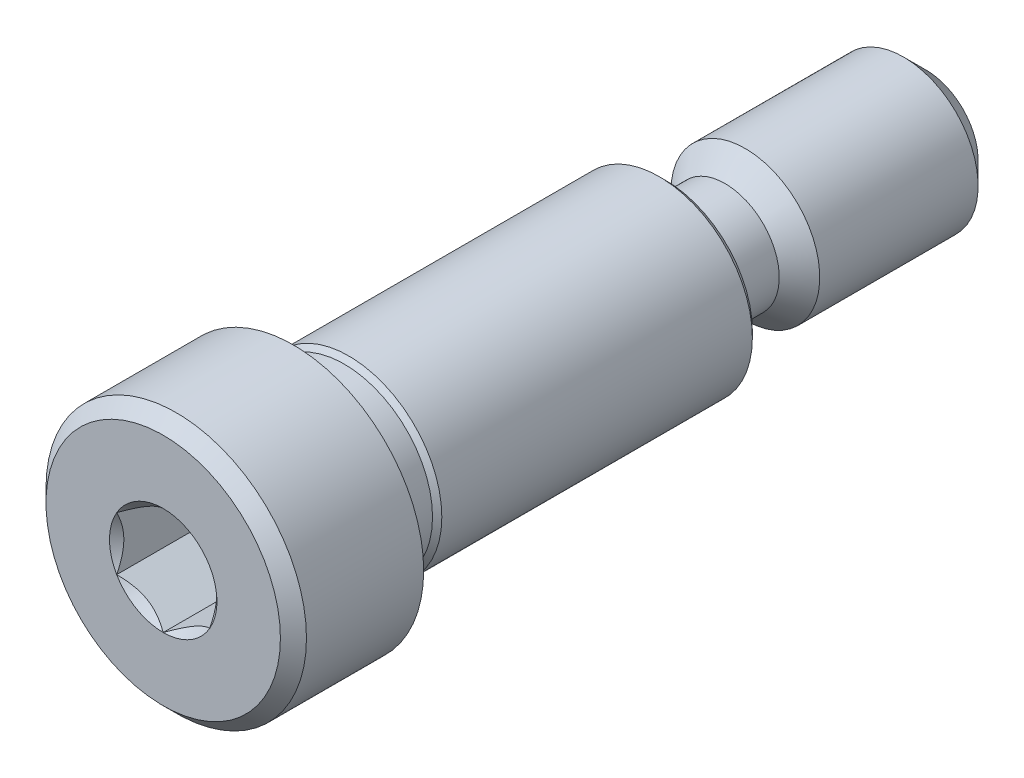
ISO-10303-21;
HEADER;
FILE_DESCRIPTION(('STEP AP214'),'2;1');
FILE_NAME('part.step','',(''),(''),'','','');
FILE_SCHEMA(('AUTOMOTIVE_DESIGN { 1 0 10303 214 1 1 1 1 }'));
ENDSEC;
DATA;
#1=APPLICATION_CONTEXT('core data for automotive mechanical design processes');
#2=APPLICATION_PROTOCOL_DEFINITION('international standard','automotive_design',2000,#1);
#3=PRODUCT_CONTEXT('',#1,'mechanical');
#4=PRODUCT('Part','Part','',(#3));
#5=PRODUCT_RELATED_PRODUCT_CATEGORY('part','',(#4));
#6=PRODUCT_DEFINITION_FORMATION('','',#4);
#7=PRODUCT_DEFINITION_CONTEXT('part definition',#1,'design');
#8=PRODUCT_DEFINITION('design','',#6,#7);
#9=PRODUCT_DEFINITION_SHAPE('','',#8);
#10=(LENGTH_UNIT() NAMED_UNIT(*) SI_UNIT(.MILLI.,.METRE.));
#11=(NAMED_UNIT(*) PLANE_ANGLE_UNIT() SI_UNIT($,.RADIAN.));
#12=(NAMED_UNIT(*) SI_UNIT($,.STERADIAN.) SOLID_ANGLE_UNIT());
#13=UNCERTAINTY_MEASURE_WITH_UNIT(LENGTH_MEASURE(1.E-05),#10,'distance_accuracy_value','');
#14=(GEOMETRIC_REPRESENTATION_CONTEXT(3) GLOBAL_UNCERTAINTY_ASSIGNED_CONTEXT((#13)) GLOBAL_UNIT_ASSIGNED_CONTEXT((#10,
#11,#12)) REPRESENTATION_CONTEXT('',''));
#15=CARTESIAN_POINT('',(0.,0.,0.));
#16=DIRECTION('',(0.,0.,1.));
#17=DIRECTION('',(1.,0.,0.));
#18=AXIS2_PLACEMENT_3D('',#15,#16,#17);
#19=CARTESIAN_POINT('',(0.,5.000625,16.271875));
#20=DIRECTION('',(0.,0.,-1.));
#21=DIRECTION('',(-1.,0.,0.));
#22=AXIS2_PLACEMENT_3D('',#19,#20,#21);
#23=PLANE('',#22);
#24=CARTESIAN_POINT('',(0.,0.,16.271875));
#25=DIRECTION('',(0.,0.,1.));
#26=DIRECTION('',(1.,0.,0.));
#27=AXIS2_PLACEMENT_3D('',#24,#25,#26);
#28=CIRCLE('',#27,2.29135888084633);
#29=CARTESIAN_POINT('',(-1.984375,1.14567944042316,16.271875));
#30=VERTEX_POINT('',#29);
#31=CARTESIAN_POINT('',(-1.984375,-1.14567944042316,16.271875));
#32=VERTEX_POINT('',#31);
#33=EDGE_CURVE('E139',#30,#32,#28,.T.);
#34=ORIENTED_EDGE('',*,*,#33,.F.);
#35=CARTESIAN_POINT('',(0.,2.29135888084633,16.271875));
#36=VERTEX_POINT('',#35);
#37=EDGE_CURVE('E132',#36,#30,#28,.T.);
#38=ORIENTED_EDGE('',*,*,#37,.F.);
#39=CARTESIAN_POINT('',(1.984375,1.14567944042317,16.271875));
#40=VERTEX_POINT('',#39);
#41=EDGE_CURVE('E104',#40,#36,#28,.T.);
#42=ORIENTED_EDGE('',*,*,#41,.F.);
#43=CARTESIAN_POINT('',(1.984375,-1.14567944042317,16.271875));
#44=VERTEX_POINT('',#43);
#45=EDGE_CURVE('E95',#44,#40,#28,.T.);
#46=ORIENTED_EDGE('',*,*,#45,.F.);
#47=CARTESIAN_POINT('',(0.,-2.29135888084633,16.271875));
#48=VERTEX_POINT('',#47);
#49=EDGE_CURVE('E53',#48,#44,#28,.T.);
#50=ORIENTED_EDGE('',*,*,#49,.F.);
#51=EDGE_CURVE('E64',#32,#48,#28,.T.);
#52=ORIENTED_EDGE('',*,*,#51,.F.);
#53=EDGE_LOOP('',(#34,#38,#42,#46,#50,#52));
#54=FACE_BOUND('',#53,.T.);
#55=CARTESIAN_POINT('',(0.,0.,16.271875));
#56=DIRECTION('',(0.,0.,1.));
#57=DIRECTION('',(1.,0.,0.));
#58=AXIS2_PLACEMENT_3D('',#55,#56,#57);
#59=CIRCLE('',#58,5.000625);
#60=CARTESIAN_POINT('',(5.000625,0.,16.271875));
#61=VERTEX_POINT('',#60);
#62=EDGE_CURVE('E48',#61,#61,#59,.T.);
#63=ORIENTED_EDGE('',*,*,#62,.T.);
#64=EDGE_LOOP('',(#63));
#65=FACE_BOUND('',#64,.T.);
#66=ADVANCED_FACE('F37',(#54,#65),#23,.F.);
#67=CARTESIAN_POINT('',(0.,0.,15.71625));
#68=DIRECTION('',(0.,0.,-1.));
#69=DIRECTION('',(-1.,0.,0.));
#70=AXIS2_PLACEMENT_3D('',#67,#68,#69);
#71=CONICAL_SURFACE('',#70,5.55625,0.785398163397447);
#72=ORIENTED_EDGE('',*,*,#62,.F.);
#73=EDGE_LOOP('',(#72));
#74=FACE_BOUND('',#73,.T.);
#75=CARTESIAN_POINT('',(0.,0.,15.71625));
#76=DIRECTION('',(0.,0.,1.));
#77=DIRECTION('',(1.,0.,0.));
#78=AXIS2_PLACEMENT_3D('',#75,#76,#77);
#79=CIRCLE('',#78,5.55625);
#80=CARTESIAN_POINT('',(5.55625,0.,15.71625));
#81=VERTEX_POINT('',#80);
#82=EDGE_CURVE('E307',#81,#81,#79,.T.);
#83=ORIENTED_EDGE('',*,*,#82,.T.);
#84=EDGE_LOOP('',(#83));
#85=FACE_BOUND('',#84,.T.);
#86=ADVANCED_FACE('F209',(#74,#85),#71,.T.);
#87=CARTESIAN_POINT('',(0.,0.,16.271875));
#88=DIRECTION('',(0.,0.,1.));
#89=DIRECTION('',(1.,0.,0.));
#90=AXIS2_PLACEMENT_3D('',#87,#88,#89);
#91=CYLINDRICAL_SURFACE('',#90,5.55625);
#92=ORIENTED_EDGE('',*,*,#82,.F.);
#93=EDGE_LOOP('',(#92));
#94=FACE_BOUND('',#93,.T.);
#95=CARTESIAN_POINT('',(0.,0.,10.715625));
#96=DIRECTION('',(0.,0.,1.));
#97=DIRECTION('',(1.,0.,0.));
#98=AXIS2_PLACEMENT_3D('',#95,#96,#97);
#99=CIRCLE('',#98,5.55625);
#100=CARTESIAN_POINT('',(5.55625,0.,10.715625));
#101=VERTEX_POINT('',#100);
#102=EDGE_CURVE('E301',#101,#101,#99,.T.);
#103=ORIENTED_EDGE('',*,*,#102,.T.);
#104=EDGE_LOOP('',(#103));
#105=FACE_BOUND('',#104,.T.);
#106=ADVANCED_FACE('F213',(#94,#105),#91,.T.);
#107=CARTESIAN_POINT('',(0.,5.55625,10.715625));
#108=DIRECTION('',(0.,0.,1.));
#109=DIRECTION('',(1.,0.,0.));
#110=AXIS2_PLACEMENT_3D('',#107,#108,#109);
#111=PLANE('',#110);
#112=ORIENTED_EDGE('',*,*,#102,.F.);
#113=EDGE_LOOP('',(#112));
#114=FACE_BOUND('',#113,.T.);
#115=CARTESIAN_POINT('',(0.,0.,10.715625));
#116=DIRECTION('',(0.,0.,1.));
#117=DIRECTION('',(1.,0.,0.));
#118=AXIS2_PLACEMENT_3D('',#115,#116,#117);
#119=CIRCLE('',#118,3.96875);
#120=CARTESIAN_POINT('',(3.96875,0.,10.715625));
#121=VERTEX_POINT('',#120);
#122=EDGE_CURVE('E299',#121,#121,#119,.T.);
#123=ORIENTED_EDGE('',*,*,#122,.T.);
#124=EDGE_LOOP('',(#123));
#125=FACE_BOUND('',#124,.T.);
#126=ADVANCED_FACE('F218',(#114,#125),#111,.F.);
#127=CARTESIAN_POINT('',(0.,0.,10.5171875));
#128=DIRECTION('',(0.,0.,1.));
#129=DIRECTION('',(1.,0.,0.));
#130=AXIS2_PLACEMENT_3D('',#127,#128,#129);
#131=CONICAL_SURFACE('',#130,3.7703125,0.785398163397452);
#132=ORIENTED_EDGE('',*,*,#122,.F.);
#133=EDGE_LOOP('',(#132));
#134=FACE_BOUND('',#133,.T.);
#135=CARTESIAN_POINT('',(0.,0.,10.5171875));
#136=DIRECTION('',(0.,0.,1.));
#137=DIRECTION('',(1.,0.,0.));
#138=AXIS2_PLACEMENT_3D('',#135,#136,#137);
#139=CIRCLE('',#138,3.7703125);
#140=CARTESIAN_POINT('',(3.7703125,0.,10.5171875));
#141=VERTEX_POINT('',#140);
#142=EDGE_CURVE('E300',#141,#141,#139,.T.);
#143=ORIENTED_EDGE('',*,*,#142,.T.);
#144=EDGE_LOOP('',(#143));
#145=FACE_BOUND('',#144,.T.);
#146=ADVANCED_FACE('F230',(#134,#145),#131,.T.);
#147=CARTESIAN_POINT('',(0.,0.,16.271875));
#148=DIRECTION('',(0.,0.,1.));
#149=DIRECTION('',(1.,0.,0.));
#150=AXIS2_PLACEMENT_3D('',#147,#148,#149);
#151=CYLINDRICAL_SURFACE('',#150,3.7703125);
#152=ORIENTED_EDGE('',*,*,#142,.F.);
#153=EDGE_LOOP('',(#152));
#154=FACE_BOUND('',#153,.T.);
#155=CARTESIAN_POINT('',(0.,0.,8.55186249999999));
#156=DIRECTION('',(0.,0.,1.));
#157=DIRECTION('',(1.,0.,0.));
#158=AXIS2_PLACEMENT_3D('',#155,#156,#157);
#159=CIRCLE('',#158,3.7703125);
#160=CARTESIAN_POINT('',(3.7703125,0.,8.55186249999999));
#161=VERTEX_POINT('',#160);
#162=EDGE_CURVE('E293',#161,#161,#159,.T.);
#163=ORIENTED_EDGE('',*,*,#162,.T.);
#164=EDGE_LOOP('',(#163));
#165=FACE_BOUND('',#164,.T.);
#166=ADVANCED_FACE('F232',(#154,#165),#151,.T.);
#167=CARTESIAN_POINT('',(0.,0.,8.353425));
#168=DIRECTION('',(0.,0.,-1.));
#169=DIRECTION('',(-1.,0.,0.));
#170=AXIS2_PLACEMENT_3D('',#167,#168,#169);
#171=CONICAL_SURFACE('',#170,3.96875,0.785398163397459);
#172=ORIENTED_EDGE('',*,*,#162,.F.);
#173=EDGE_LOOP('',(#172));
#174=FACE_BOUND('',#173,.T.);
#175=CARTESIAN_POINT('',(0.,0.,8.353425));
#176=DIRECTION('',(0.,0.,1.));
#177=DIRECTION('',(1.,0.,0.));
#178=AXIS2_PLACEMENT_3D('',#175,#176,#177);
#179=CIRCLE('',#178,3.96875);
#180=CARTESIAN_POINT('',(3.96875,0.,8.353425));
#181=VERTEX_POINT('',#180);
#182=EDGE_CURVE('E294',#181,#181,#179,.T.);
#183=ORIENTED_EDGE('',*,*,#182,.T.);
#184=EDGE_LOOP('',(#183));
#185=FACE_BOUND('',#184,.T.);
#186=ADVANCED_FACE('F233',(#174,#185),#171,.T.);
#187=CARTESIAN_POINT('',(0.,0.,16.271875));
#188=DIRECTION('',(0.,0.,1.));
#189=DIRECTION('',(1.,0.,0.));
#190=AXIS2_PLACEMENT_3D('',#187,#188,#189);
#191=CYLINDRICAL_SURFACE('',#190,3.96875);
#192=ORIENTED_EDGE('',*,*,#182,.F.);
#193=EDGE_LOOP('',(#192));
#194=FACE_BOUND('',#193,.T.);
#195=CARTESIAN_POINT('',(0.,0.,-4.89479166666666));
#196=DIRECTION('',(0.,0.,1.));
#197=DIRECTION('',(1.,0.,0.));
#198=AXIS2_PLACEMENT_3D('',#195,#196,#197);
#199=CIRCLE('',#198,3.96875);
#200=CARTESIAN_POINT('',(3.96875,0.,-4.89479166666666));
#201=VERTEX_POINT('',#200);
#202=EDGE_CURVE('E290',#201,#201,#199,.T.);
#203=ORIENTED_EDGE('',*,*,#202,.T.);
#204=EDGE_LOOP('',(#203));
#205=FACE_BOUND('',#204,.T.);
#206=ADVANCED_FACE('F238',(#194,#205),#191,.T.);
#207=CARTESIAN_POINT('',(0.,0.,-5.159375));
#208=DIRECTION('',(0.,0.,1.));
#209=DIRECTION('',(1.,0.,0.));
#210=AXIS2_PLACEMENT_3D('',#207,#208,#209);
#211=CONICAL_SURFACE('',#210,3.70416666666667,0.785398163397439);
#212=ORIENTED_EDGE('',*,*,#202,.F.);
#213=EDGE_LOOP('',(#212));
#214=FACE_BOUND('',#213,.T.);
#215=CARTESIAN_POINT('',(0.,0.,-5.159375));
#216=DIRECTION('',(0.,0.,1.));
#217=DIRECTION('',(1.,0.,0.));
#218=AXIS2_PLACEMENT_3D('',#215,#216,#217);
#219=CIRCLE('',#218,3.70416666666667);
#220=CARTESIAN_POINT('',(3.70416666666667,0.,-5.159375));
#221=VERTEX_POINT('',#220);
#222=EDGE_CURVE('E276',#221,#221,#219,.T.);
#223=ORIENTED_EDGE('',*,*,#222,.T.);
#224=EDGE_LOOP('',(#223));
#225=FACE_BOUND('',#224,.T.);
#226=ADVANCED_FACE('F245',(#214,#225),#211,.T.);
#227=CARTESIAN_POINT('',(0.,3.70416666666667,-5.159375));
#228=DIRECTION('',(0.,0.,1.));
#229=DIRECTION('',(1.,0.,0.));
#230=AXIS2_PLACEMENT_3D('',#227,#228,#229);
#231=PLANE('',#230);
#232=CARTESIAN_POINT('',(0.,0.,-5.159375));
#233=DIRECTION('',(0.,0.,-1.));
#234=DIRECTION('',(-1.,0.,0.));
#235=AXIS2_PLACEMENT_3D('',#232,#233,#234);
#236=CIRCLE('',#235,3.175);
#237=CARTESIAN_POINT('',(-3.175,0.,-5.159375));
#238=VERTEX_POINT('',#237);
#239=EDGE_CURVE('E441',#238,#238,#236,.T.);
#240=ORIENTED_EDGE('',*,*,#239,.F.);
#241=EDGE_LOOP('',(#240));
#242=FACE_BOUND('',#241,.T.);
#243=ORIENTED_EDGE('',*,*,#222,.F.);
#244=EDGE_LOOP('',(#243));
#245=FACE_BOUND('',#244,.T.);
#246=ADVANCED_FACE('F250',(#242,#245),#231,.F.);
#247=CARTESIAN_POINT('',(0.,0.,16.271875));
#248=DIRECTION('',(0.,0.,1.));
#249=DIRECTION('',(1.,0.,0.));
#250=AXIS2_PLACEMENT_3D('',#247,#248,#249);
#251=CONICAL_SURFACE('',#250,2.29135888084633,0.78539816339745);
#252=ORIENTED_EDGE('',*,*,#41,.T.);
#253=CARTESIAN_POINT('',(1.984575,1.14556397036933,16.2719904787818));
#254=CARTESIAN_POINT('',(1.9163590048332,1.18494849354192,16.2326378522639));
#255=CARTESIAN_POINT('',(1.84700231489303,1.22499159714897,16.1955963104462));
#256=CARTESIAN_POINT('',(1.70557619954781,1.30664400291398,16.1277738584233));
#257=CARTESIAN_POINT('',(1.63349332126322,1.34826107209555,16.0970306890917));
#258=CARTESIAN_POINT('',(1.488141602734,1.43217992591557,16.0443668888112));
#259=CARTESIAN_POINT('',(1.41490978751306,1.47446033414663,16.02231387588));
#260=CARTESIAN_POINT('',(1.2668338174053,1.55995203534886,15.9883364929439));
#261=CARTESIAN_POINT('',(1.19199418724658,1.60316071596705,15.9763867560917));
#262=CARTESIAN_POINT('',(1.06301458545619,1.6776271237807,15.9656050990819));
#263=CARTESIAN_POINT('',(1.00904128422756,1.7087886237741,15.9640088990591));
#264=CARTESIAN_POINT('',(0.901182881480202,1.77106070163465,15.9666968388653));
#265=CARTESIAN_POINT('',(0.84729781751448,1.80217125782056,15.9709830403405));
#266=CARTESIAN_POINT('',(0.740036461751399,1.86409863044402,15.9851918730135));
#267=CARTESIAN_POINT('',(0.686660807239863,1.89491507894443,15.9951208104523));
#268=CARTESIAN_POINT('',(0.580832482591107,1.95601509066827,16.0200700842745));
#269=CARTESIAN_POINT('',(0.528379742028902,1.9862986945516,16.0350900303895));
#270=CARTESIAN_POINT('',(0.394017661036354,2.06387267818152,16.0796828516357));
#271=CARTESIAN_POINT('',(0.312941642841679,2.11068193911104,16.1126179959383));
#272=CARTESIAN_POINT('',(0.193726693270163,2.17951072233758,16.1682174412022));
#273=CARTESIAN_POINT('',(0.154440075614001,2.20219286161692,16.1877525920519));
#274=CARTESIAN_POINT('',(0.0765946381319486,2.24713694590237,16.2286037381194));
#275=CARTESIAN_POINT('',(0.0380353888983024,2.26939913882716,16.2499186395683));
#276=CARTESIAN_POINT('',(-0.000199999999998845,2.29147435090017,16.2719904787818));
#277=B_SPLINE_CURVE_WITH_KNOTS('',3,(#253,#254,#255,#256,#257,#258,#259,#260,#261,#262,#263,
#264,#265,#266,#267,#268,#269,#270,#271,#272,#273,#274,#275,#276),.UNSPECIFIED.,.F.,.F.,(4,2,2,
2,2,2,2,2,2,2,2,4),(0.,0.264339630306627,0.530219665093693,0.791876416371457,1.05287424418109,
1.239639843932,1.42647091743852,1.61351120244034,1.8005371524754,2.09764209964316,
2.24579179873713,2.39385111134157),.UNSPECIFIED.);
#278=EDGE_CURVE('E11',#40,#36,#277,.T.);
#279=ORIENTED_EDGE('',*,*,#278,.F.);
#280=EDGE_LOOP('',(#252,#279));
#281=FACE_BOUND('',#280,.T.);
#282=ADVANCED_FACE('F108',(#281),#251,.F.);
#283=ORIENTED_EDGE('',*,*,#37,.T.);
#284=CARTESIAN_POINT('',(0.000200000000000114,2.29147435090017,16.2719904787818));
#285=CARTESIAN_POINT('',(-0.0680159951668023,2.25208982772757,16.2326378522639));
#286=CARTESIAN_POINT('',(-0.137372685106966,2.21204672412052,16.1955963104462));
#287=CARTESIAN_POINT('',(-0.278798800452186,2.13039431835551,16.1277738584233));
#288=CARTESIAN_POINT('',(-0.350881678736781,2.08877724917394,16.0970306890918));
#289=CARTESIAN_POINT('',(-0.496233397266002,2.00485839535392,16.0443668888112));
#290=CARTESIAN_POINT('',(-0.569465212486936,1.96257798712287,16.02231387588));
#291=CARTESIAN_POINT('',(-0.717541182594704,1.87708628592063,15.9883364929439));
#292=CARTESIAN_POINT('',(-0.792380812753422,1.83387760530245,15.9763867560917));
#293=CARTESIAN_POINT('',(-0.921360414543813,1.75941119748879,15.9656050990819));
#294=CARTESIAN_POINT('',(-0.97533371577244,1.72824969749539,15.9640088990591));
#295=CARTESIAN_POINT('',(-1.0831921185198,1.66597761963484,15.9666968388653));
#296=CARTESIAN_POINT('',(-1.13707718248552,1.63486706344893,15.9709830403405));
#297=CARTESIAN_POINT('',(-1.2443385382486,1.57293969082547,15.9851918730135));
#298=CARTESIAN_POINT('',(-1.29771419276014,1.54212324232507,15.9951208104523));
#299=CARTESIAN_POINT('',(-1.40354251740889,1.48102323060122,16.0200700842745));
#300=CARTESIAN_POINT('',(-1.4559952579711,1.4507396267179,16.0350900303895));
#301=CARTESIAN_POINT('',(-1.59035733896365,1.37316564308797,16.0796828516357));
#302=CARTESIAN_POINT('',(-1.67143335715832,1.32635638215845,16.1126179959383));
#303=CARTESIAN_POINT('',(-1.79064830672984,1.25752759893191,16.1682174412022));
#304=CARTESIAN_POINT('',(-1.829934924386,1.23484545965257,16.1877525920519));
#305=CARTESIAN_POINT('',(-1.90778036186805,1.18990137536713,16.2286037381194));
#306=CARTESIAN_POINT('',(-1.9463396111017,1.16763918244233,16.2499186395684));
#307=CARTESIAN_POINT('',(-1.984575,1.14556397036933,16.2719904787818));
#308=B_SPLINE_CURVE_WITH_KNOTS('',3,(#284,#285,#286,#287,#288,#289,#290,#291,#292,#293,#294,
#295,#296,#297,#298,#299,#300,#301,#302,#303,#304,#305,#306,#307),.UNSPECIFIED.,.F.,.F.,(4,2,2,
2,2,2,2,2,2,2,2,4),(0.,0.264339630306625,0.530219665093691,0.791876416371457,1.05287424418109,
1.239639843932,1.42647091743852,1.61351120244034,1.8005371524754,2.09764209964316,
2.24579179873713,2.39385111134157),.UNSPECIFIED.);
#309=EDGE_CURVE('E135',#36,#30,#308,.T.);
#310=ORIENTED_EDGE('',*,*,#309,.F.);
#311=EDGE_LOOP('',(#283,#310));
#312=FACE_BOUND('',#311,.T.);
#313=ADVANCED_FACE('F339',(#312),#251,.F.);
#314=ORIENTED_EDGE('',*,*,#33,.T.);
#315=CARTESIAN_POINT('',(-1.984375,-2.28495242157822,17.0068590788166));
#316=CARTESIAN_POINT('',(-1.984375,-2.22931635455402,16.9648616855508));
#317=CARTESIAN_POINT('',(-1.984375,-2.17336876548389,16.9232710540763));
#318=CARTESIAN_POINT('',(-1.984375,-2.06072770258171,16.8410834614715));
#319=CARTESIAN_POINT('',(-1.984375,-2.00403404503435,16.800486752405));
#320=CARTESIAN_POINT('',(-1.984375,-1.88936329173489,16.7201785031747));
#321=CARTESIAN_POINT('',(-1.984375,-1.83137965519348,16.6804762588133));
#322=CARTESIAN_POINT('',(-1.984375,-1.71442802137841,16.6025601734013));
#323=CARTESIAN_POINT('',(-1.984375,-1.65546009407228,16.5643462271944));
#324=CARTESIAN_POINT('',(-1.984375,-1.47005472306036,16.4481278340136));
#325=CARTESIAN_POINT('',(-1.984375,-1.34163909427884,16.3732228868724));
#326=CARTESIAN_POINT('',(-1.984375,-1.0784038470548,16.2362052154397));
#327=CARTESIAN_POINT('',(-1.984375,-0.943607781407427,16.1740493664824));
#328=CARTESIAN_POINT('',(-1.984375,-0.741275100444884,16.0980075786886));
#329=CARTESIAN_POINT('',(-1.984375,-0.676735408881097,16.076183061326));
#330=CARTESIAN_POINT('',(-1.984375,-0.546098118112763,16.0377154635378));
#331=CARTESIAN_POINT('',(-1.984375,-0.480000411919957,16.0210727400656));
#332=CARTESIAN_POINT('',(-1.984375,-0.347746170028533,15.9941103808697));
#333=CARTESIAN_POINT('',(-1.984375,-0.281612071479124,15.9836824097359));
#334=CARTESIAN_POINT('',(-1.984375,-0.148636620052351,15.9693531473766));
#335=CARTESIAN_POINT('',(-1.984375,-0.0817953907393253,15.9654507342274));
#336=CARTESIAN_POINT('',(-1.984375,0.0495156750890627,15.9644620513327));
#337=CARTESIAN_POINT('',(-1.984375,0.11398377510299,15.967134178875));
#338=CARTESIAN_POINT('',(-1.984375,0.242367515846175,15.9786142104975));
#339=CARTESIAN_POINT('',(-1.984375,0.306283102295918,15.9874227106392));
#340=CARTESIAN_POINT('',(-1.984375,0.434181040262182,16.0108440213329));
#341=CARTESIAN_POINT('',(-1.984375,0.498145026858308,16.0255556062321));
#342=CARTESIAN_POINT('',(-1.984375,0.624675616953006,16.0600011814121));
#343=CARTESIAN_POINT('',(-1.984375,0.687242336899688,16.0797347514492));
#344=CARTESIAN_POINT('',(-1.984375,0.884225483826086,16.1492872372308));
#345=CARTESIAN_POINT('',(-1.984375,1.01583674256468,16.2070274112565));
#346=CARTESIAN_POINT('',(-1.984375,1.27288659242652,16.3354053365888));
#347=CARTESIAN_POINT('',(-1.984375,1.3983008827048,16.4060894249194));
#348=CARTESIAN_POINT('',(-1.984375,1.57956687990221,16.5163916638132));
#349=CARTESIAN_POINT('',(-1.984375,1.63738271299424,16.5528448294754));
#350=CARTESIAN_POINT('',(-1.984375,1.75202215386202,16.6272909632917));
#351=CARTESIAN_POINT('',(-1.984375,1.80884568601362,16.665284048078));
#352=CARTESIAN_POINT('',(-1.984375,1.92116923084255,16.7422138088931));
#353=CARTESIAN_POINT('',(-1.984375,1.97667624512253,16.7811403130388));
#354=CARTESIAN_POINT('',(-1.984375,2.08693170717166,16.8600227461214));
#355=CARTESIAN_POINT('',(-1.984375,2.14168035934792,16.899978389024));
#356=CARTESIAN_POINT('',(-1.984375,2.19611149046622,16.9403556112854));
#357=B_SPLINE_CURVE_WITH_KNOTS('',3,(#315,#316,#317,#318,#319,#320,#321,#322,#323,#324,#325,
#326,#327,#328,#329,#330,#331,#332,#333,#334,#335,#336,#337,#338,#339,#340,#341,#342,#343,#344,
#345,#346,#347,#348,#349,#350,#351,#352,#353,#354,#355,#356),.UNSPECIFIED.,.F.,.F.,(4,2,2,2,2,2,
2,2,2,2,2,2,2,2,2,2,2,2,2,2,4),(0.,0.20912607000832,0.418304637356566,0.629103979977989,
0.839888401371181,1.28549951116127,1.72957750768351,1.93379389749971,2.13802435186698,
2.33858179514333,2.53910475350639,2.73236963400794,2.92565329006887,3.12231577097487,
3.31896180041345,3.74886295245172,4.18033428125362,4.3853601718029,4.59040161996382,
4.79377749165107,4.99709743524131),.UNSPECIFIED.);
#358=EDGE_CURVE('E131',#30,#32,#357,.F.);
#359=ORIENTED_EDGE('',*,*,#358,.F.);
#360=EDGE_LOOP('',(#314,#359));
#361=FACE_BOUND('',#360,.T.);
#362=ADVANCED_FACE('F332',(#361),#251,.F.);
#363=ORIENTED_EDGE('',*,*,#51,.T.);
#364=CARTESIAN_POINT('',(-1.984575,-1.14556397036933,16.2719904787818));
#365=CARTESIAN_POINT('',(-1.9163590048332,-1.18494849354192,16.2326378522639));
#366=CARTESIAN_POINT('',(-1.84700231489303,-1.22499159714897,16.1955963104462));
#367=CARTESIAN_POINT('',(-1.70557619954781,-1.30664400291398,16.1277738584233));
#368=CARTESIAN_POINT('',(-1.63349332126322,-1.34826107209555,16.0970306890917));
#369=CARTESIAN_POINT('',(-1.488141602734,-1.43217992591557,16.0443668888112));
#370=CARTESIAN_POINT('',(-1.41490978751306,-1.47446033414662,16.02231387588));
#371=CARTESIAN_POINT('',(-1.2668338174053,-1.55995203534886,15.9883364929439));
#372=CARTESIAN_POINT('',(-1.19199418724658,-1.60316071596705,15.9763867560917));
#373=CARTESIAN_POINT('',(-1.06301458545619,-1.6776271237807,15.9656050990819));
#374=CARTESIAN_POINT('',(-1.00904128422756,-1.7087886237741,15.9640088990591));
#375=CARTESIAN_POINT('',(-0.901182881480202,-1.77106070163465,15.9666968388653));
#376=CARTESIAN_POINT('',(-0.84729781751448,-1.80217125782056,15.9709830403405));
#377=CARTESIAN_POINT('',(-0.740036461751399,-1.86409863044402,15.9851918730135));
#378=CARTESIAN_POINT('',(-0.686660807239862,-1.89491507894443,15.9951208104523));
#379=CARTESIAN_POINT('',(-0.580832482591106,-1.95601509066827,16.0200700842745));
#380=CARTESIAN_POINT('',(-0.528379742028901,-1.9862986945516,16.0350900303895));
#381=CARTESIAN_POINT('',(-0.394017661036354,-2.06387267818152,16.0796828516357));
#382=CARTESIAN_POINT('',(-0.312941642841678,-2.11068193911104,16.1126179959383));
#383=CARTESIAN_POINT('',(-0.193726693270162,-2.17951072233758,16.1682174412022));
#384=CARTESIAN_POINT('',(-0.154440075614,-2.20219286161692,16.1877525920519));
#385=CARTESIAN_POINT('',(-0.0765946381319483,-2.24713694590237,16.2286037381194));
#386=CARTESIAN_POINT('',(-0.0380353888983021,-2.26939913882716,16.2499186395683));
#387=CARTESIAN_POINT('',(0.000199999999999197,-2.29147435090017,16.2719904787818));
#388=B_SPLINE_CURVE_WITH_KNOTS('',3,(#364,#365,#366,#367,#368,#369,#370,#371,#372,#373,#374,
#375,#376,#377,#378,#379,#380,#381,#382,#383,#384,#385,#386,#387),.UNSPECIFIED.,.F.,.F.,(4,2,2,
2,2,2,2,2,2,2,2,4),(0.,0.264339630306625,0.530219665093693,0.791876416371458,1.05287424418109,
1.239639843932,1.42647091743852,1.61351120244034,1.8005371524754,2.09764209964316,
2.24579179873713,2.39385111134157),.UNSPECIFIED.);
#389=EDGE_CURVE('E172',#32,#48,#388,.T.);
#390=ORIENTED_EDGE('',*,*,#389,.F.);
#391=EDGE_LOOP('',(#363,#390));
#392=FACE_BOUND('',#391,.T.);
#393=ADVANCED_FACE('F331',(#392),#251,.F.);
#394=ORIENTED_EDGE('',*,*,#49,.T.);
#395=CARTESIAN_POINT('',(-0.000200000000000085,-2.29147435090017,16.2719904787818));
#396=CARTESIAN_POINT('',(0.068015995166803,-2.25208982772757,16.2326378522639));
#397=CARTESIAN_POINT('',(0.137372685106966,-2.21204672412052,16.1955963104462));
#398=CARTESIAN_POINT('',(0.278798800452187,-2.13039431835551,16.1277738584233));
#399=CARTESIAN_POINT('',(0.350881678736782,-2.08877724917394,16.0970306890917));
#400=CARTESIAN_POINT('',(0.496233397266003,-2.00485839535392,16.0443668888112));
#401=CARTESIAN_POINT('',(0.569465212486938,-1.96257798712287,16.02231387588));
#402=CARTESIAN_POINT('',(0.717541182594705,-1.87708628592063,15.9883364929439));
#403=CARTESIAN_POINT('',(0.792380812753423,-1.83387760530244,15.9763867560917));
#404=CARTESIAN_POINT('',(0.921360414543813,-1.75941119748879,15.9656050990819));
#405=CARTESIAN_POINT('',(0.97533371577244,-1.72824969749539,15.9640088990591));
#406=CARTESIAN_POINT('',(1.0831921185198,-1.66597761963484,15.9666968388653));
#407=CARTESIAN_POINT('',(1.13707718248552,-1.63486706344893,15.9709830403405));
#408=CARTESIAN_POINT('',(1.2443385382486,-1.57293969082547,15.9851918730135));
#409=CARTESIAN_POINT('',(1.29771419276014,-1.54212324232506,15.9951208104523));
#410=CARTESIAN_POINT('',(1.40354251740889,-1.48102323060122,16.0200700842745));
#411=CARTESIAN_POINT('',(1.4559952579711,-1.4507396267179,16.0350900303895));
#412=CARTESIAN_POINT('',(1.59035733896365,-1.37316564308797,16.0796828516357));
#413=CARTESIAN_POINT('',(1.67143335715832,-1.32635638215845,16.1126179959383));
#414=CARTESIAN_POINT('',(1.79064830672984,-1.25752759893191,16.1682174412022));
#415=CARTESIAN_POINT('',(1.829934924386,-1.23484545965258,16.1877525920519));
#416=CARTESIAN_POINT('',(1.90778036186805,-1.18990137536713,16.2286037381194));
#417=CARTESIAN_POINT('',(1.9463396111017,-1.16763918244233,16.2499186395683));
#418=CARTESIAN_POINT('',(1.984575,-1.14556397036933,16.2719904787818));
#419=B_SPLINE_CURVE_WITH_KNOTS('',3,(#395,#396,#397,#398,#399,#400,#401,#402,#403,#404,#405,
#406,#407,#408,#409,#410,#411,#412,#413,#414,#415,#416,#417,#418),.UNSPECIFIED.,.F.,.F.,(4,2,2,
2,2,2,2,2,2,2,2,4),(0.,0.264339630306625,0.530219665093693,0.791876416371458,1.05287424418109,
1.239639843932,1.42647091743852,1.61351120244034,1.8005371524754,2.09764209964316,
2.24579179873713,2.39385111134157),.UNSPECIFIED.);
#420=EDGE_CURVE('E118',#48,#44,#419,.T.);
#421=ORIENTED_EDGE('',*,*,#420,.F.);
#422=EDGE_LOOP('',(#394,#421));
#423=FACE_BOUND('',#422,.T.);
#424=ADVANCED_FACE('F158',(#423),#251,.F.);
#425=ORIENTED_EDGE('',*,*,#45,.T.);
#426=CARTESIAN_POINT('',(1.984375,-2.28495242191067,17.0068590790676));
#427=CARTESIAN_POINT('',(1.984375,-2.22931635487714,16.9648616857921));
#428=CARTESIAN_POINT('',(1.984375,-2.17336876579766,16.923271054308));
#429=CARTESIAN_POINT('',(1.984375,-2.06072770287666,16.8410834616839));
#430=CARTESIAN_POINT('',(1.984375,-2.00403404531985,16.8004867526079));
#431=CARTESIAN_POINT('',(1.984375,-1.88936329200117,16.7201785033582));
#432=CARTESIAN_POINT('',(1.984375,-1.83137965544999,16.6804762589872));
#433=CARTESIAN_POINT('',(1.984375,-1.71442802161519,16.602560173556));
#434=CARTESIAN_POINT('',(1.984375,-1.65546009429911,16.5643462273396));
#435=CARTESIAN_POINT('',(1.984375,-1.47005472325436,16.4481278341287));
#436=CARTESIAN_POINT('',(1.984375,-1.34163909444949,16.3732228869673));
#437=CARTESIAN_POINT('',(1.984375,-1.07840384717678,16.2362052154972));
#438=CARTESIAN_POINT('',(1.984375,-0.943607781504099,16.1740493665226));
#439=CARTESIAN_POINT('',(1.984375,-0.74127510052251,16.098007578716));
#440=CARTESIAN_POINT('',(1.984375,-0.676735408966699,16.0761830613539));
#441=CARTESIAN_POINT('',(1.984375,-0.546098118214578,16.0377154635651));
#442=CARTESIAN_POINT('',(1.984375,-0.480000412030008,16.0210727400917));
#443=CARTESIAN_POINT('',(1.984375,-0.347746170154786,15.9941103808918));
#444=CARTESIAN_POINT('',(1.984375,-0.281612071613338,15.983682409755));
#445=CARTESIAN_POINT('',(1.984375,-0.148636620202221,15.9693531473881));
#446=CARTESIAN_POINT('',(1.984375,-0.0817953908968891,15.9654507342341));
#447=CARTESIAN_POINT('',(1.984375,0.049515674917302,15.9644620513286));
#448=CARTESIAN_POINT('',(1.984375,0.113983774924707,15.967134178865));
#449=CARTESIAN_POINT('',(1.984375,0.2423675156555,15.9786142104746));
#450=CARTESIAN_POINT('',(1.984375,0.306283102099374,15.9874227106093));
#451=CARTESIAN_POINT('',(1.984375,0.43418104005405,16.0108440212885));
#452=CARTESIAN_POINT('',(1.984375,0.498145026644475,16.0255556061801));
#453=CARTESIAN_POINT('',(1.984375,0.624675616728323,16.0600011813447));
#454=CARTESIAN_POINT('',(1.984375,0.687242336669855,16.079734751374));
#455=CARTESIAN_POINT('',(1.984375,0.884225483546208,16.1492872371188));
#456=CARTESIAN_POINT('',(1.984375,1.01583674224241,16.2070274111108));
#457=CARTESIAN_POINT('',(1.984375,1.27288659202273,16.3354053363718));
#458=CARTESIAN_POINT('',(1.984375,1.39830088226189,16.4060894246649));
#459=CARTESIAN_POINT('',(1.984375,1.57956687940503,16.5163916635036));
#460=CARTESIAN_POINT('',(1.984375,1.63738271248117,16.5528448291489));
#461=CARTESIAN_POINT('',(1.984375,1.75202215331741,16.6272909629313));
#462=CARTESIAN_POINT('',(1.984375,1.80884568545335,16.6652840477007));
#463=CARTESIAN_POINT('',(1.984375,1.92116923025135,16.7422138084819));
#464=CARTESIAN_POINT('',(1.984375,1.97667624451605,16.7811403126108));
#465=CARTESIAN_POINT('',(1.984375,2.08693170653472,16.8600227456598));
#466=CARTESIAN_POINT('',(1.984375,2.1416803586958,16.8999783885457));
#467=CARTESIAN_POINT('',(1.984375,2.19611148979894,16.9403556107903));
#468=B_SPLINE_CURVE_WITH_KNOTS('',3,(#426,#427,#428,#429,#430,#431,#432,#433,#434,#435,#436,
#437,#438,#439,#440,#441,#442,#443,#444,#445,#446,#447,#448,#449,#450,#451,#452,#453,#454,#455,
#456,#457,#458,#459,#460,#461,#462,#463,#464,#465,#466,#467),.UNSPECIFIED.,.F.,.F.,(4,2,2,2,2,2,
2,2,2,2,2,2,2,2,2,2,2,2,2,2,4),(0.,0.209126070048129,0.418304637436192,0.629103980098182,
0.839888401531931,1.28549951141298,1.72957750802533,1.93379389781847,2.13802435216272,
2.33858179541699,2.53910475375796,2.7323696342393,2.92565329027999,3.12231577116422,
3.31896180058102,3.7488629524628,4.18033428110718,4.38536017158908,4.59040161968261,
4.79377749130339,4.99709743482716),.UNSPECIFIED.);
#469=EDGE_CURVE('E100',#44,#40,#468,.T.);
#470=ORIENTED_EDGE('',*,*,#469,.F.);
#471=EDGE_LOOP('',(#425,#470));
#472=FACE_BOUND('',#471,.T.);
#473=ADVANCED_FACE('F92',(#472),#251,.F.);
#474=CARTESIAN_POINT('',(0.,0.,12.1046875));
#475=DIRECTION('',(0.,0.,1.));
#476=DIRECTION('',(1.,0.,0.));
#477=AXIS2_PLACEMENT_3D('',#474,#475,#476);
#478=PLANE('',#477);
#479=DIRECTION('',(0.,1.,0.));
#480=VECTOR('',#479,1.);
#481=CARTESIAN_POINT('',(1.984375,-1.14567944042317,12.1046875));
#482=LINE('',#481,#480);
#483=CARTESIAN_POINT('',(1.984375,-1.14567944042317,12.1046875));
#484=VERTEX_POINT('',#483);
#485=CARTESIAN_POINT('',(1.984375,1.14567944042317,12.1046875));
#486=VERTEX_POINT('',#485);
#487=EDGE_CURVE('E120',#484,#486,#482,.T.);
#488=ORIENTED_EDGE('',*,*,#487,.T.);
#489=DIRECTION('',(-0.866025403784439,0.5,0.));
#490=VECTOR('',#489,1.);
#491=CARTESIAN_POINT('',(1.984375,1.14567944042317,12.1046875));
#492=LINE('',#491,#490);
#493=CARTESIAN_POINT('',(0.,2.29135888084633,12.1046875));
#494=VERTEX_POINT('',#493);
#495=EDGE_CURVE('E125',#486,#494,#492,.T.);
#496=ORIENTED_EDGE('',*,*,#495,.T.);
#497=DIRECTION('',(-0.866025403784439,-0.5,0.));
#498=VECTOR('',#497,1.);
#499=CARTESIAN_POINT('',(0.,2.29135888084633,12.1046875));
#500=LINE('',#499,#498);
#501=CARTESIAN_POINT('',(-1.984375,1.14567944042316,12.1046875));
#502=VERTEX_POINT('',#501);
#503=EDGE_CURVE('E262',#494,#502,#500,.T.);
#504=ORIENTED_EDGE('',*,*,#503,.T.);
#505=DIRECTION('',(0.,-1.,0.));
#506=VECTOR('',#505,1.);
#507=CARTESIAN_POINT('',(-1.984375,1.14567944042316,12.1046875));
#508=LINE('',#507,#506);
#509=CARTESIAN_POINT('',(-1.984375,-1.14567944042316,12.1046875));
#510=VERTEX_POINT('',#509);
#511=EDGE_CURVE('E267',#502,#510,#508,.T.);
#512=ORIENTED_EDGE('',*,*,#511,.T.);
#513=DIRECTION('',(0.866025403784439,-0.5,0.));
#514=VECTOR('',#513,1.);
#515=CARTESIAN_POINT('',(-1.984375,-1.14567944042316,12.1046875));
#516=LINE('',#515,#514);
#517=CARTESIAN_POINT('',(0.,-2.29135888084633,12.1046875));
#518=VERTEX_POINT('',#517);
#519=EDGE_CURVE('E275',#510,#518,#516,.T.);
#520=ORIENTED_EDGE('',*,*,#519,.T.);
#521=DIRECTION('',(0.866025403784439,0.5,0.));
#522=VECTOR('',#521,1.);
#523=CARTESIAN_POINT('',(0.,-2.29135888084633,12.1046875));
#524=LINE('',#523,#522);
#525=EDGE_CURVE('E124',#518,#484,#524,.T.);
#526=ORIENTED_EDGE('',*,*,#525,.T.);
#527=EDGE_LOOP('',(#488,#496,#504,#512,#520,#526));
#528=FACE_BOUND('',#527,.T.);
#529=ADVANCED_FACE('F159',(#528),#478,.T.);
#530=CARTESIAN_POINT('',(1.984375,1.14567944042317,12.1046875));
#531=DIRECTION('',(0.5,0.866025403784439,0.));
#532=DIRECTION('',(-0.866025403784439,0.5,0.));
#533=AXIS2_PLACEMENT_3D('',#530,#531,#532);
#534=PLANE('',#533);
#535=DIRECTION('',(0.,0.,1.));
#536=VECTOR('',#535,1.);
#537=CARTESIAN_POINT('',(1.984375,1.14567944042317,12.1046875));
#538=LINE('',#537,#536);
#539=EDGE_CURVE('E114',#486,#40,#538,.T.);
#540=ORIENTED_EDGE('',*,*,#539,.T.);
#541=ORIENTED_EDGE('',*,*,#278,.T.);
#542=DIRECTION('',(0.,0.,1.));
#543=VECTOR('',#542,1.);
#544=CARTESIAN_POINT('',(0.,2.29135888084633,12.1046875));
#545=LINE('',#544,#543);
#546=EDGE_CURVE('E122',#494,#36,#545,.T.);
#547=ORIENTED_EDGE('',*,*,#546,.F.);
#548=ORIENTED_EDGE('',*,*,#495,.F.);
#549=EDGE_LOOP('',(#540,#541,#547,#548));
#550=FACE_BOUND('',#549,.T.);
#551=ADVANCED_FACE('F119',(#550),#534,.F.);
#552=CARTESIAN_POINT('',(0.,2.29135888084633,12.1046875));
#553=DIRECTION('',(-0.5,0.866025403784439,0.));
#554=DIRECTION('',(-0.866025403784439,-0.5,0.));
#555=AXIS2_PLACEMENT_3D('',#552,#553,#554);
#556=PLANE('',#555);
#557=ORIENTED_EDGE('',*,*,#546,.T.);
#558=ORIENTED_EDGE('',*,*,#309,.T.);
#559=DIRECTION('',(0.,0.,1.));
#560=VECTOR('',#559,1.);
#561=CARTESIAN_POINT('',(-1.984375,1.14567944042316,12.1046875));
#562=LINE('',#561,#560);
#563=EDGE_CURVE('E284',#502,#30,#562,.T.);
#564=ORIENTED_EDGE('',*,*,#563,.F.);
#565=ORIENTED_EDGE('',*,*,#503,.F.);
#566=EDGE_LOOP('',(#557,#558,#564,#565));
#567=FACE_BOUND('',#566,.T.);
#568=ADVANCED_FACE('F155',(#567),#556,.F.);
#569=CARTESIAN_POINT('',(-1.984375,1.14567944042316,12.1046875));
#570=DIRECTION('',(-1.,0.,0.));
#571=DIRECTION('',(0.,-1.,0.));
#572=AXIS2_PLACEMENT_3D('',#569,#570,#571);
#573=PLANE('',#572);
#574=ORIENTED_EDGE('',*,*,#563,.T.);
#575=ORIENTED_EDGE('',*,*,#358,.T.);
#576=DIRECTION('',(0.,0.,1.));
#577=VECTOR('',#576,1.);
#578=CARTESIAN_POINT('',(-1.984375,-1.14567944042316,12.1046875));
#579=LINE('',#578,#577);
#580=EDGE_CURVE('E279',#510,#32,#579,.T.);
#581=ORIENTED_EDGE('',*,*,#580,.F.);
#582=ORIENTED_EDGE('',*,*,#511,.F.);
#583=EDGE_LOOP('',(#574,#575,#581,#582));
#584=FACE_BOUND('',#583,.T.);
#585=ADVANCED_FACE('F198',(#584),#573,.F.);
#586=CARTESIAN_POINT('',(-1.984375,-1.14567944042316,12.1046875));
#587=DIRECTION('',(-0.5,-0.866025403784439,0.));
#588=DIRECTION('',(0.866025403784439,-0.5,0.));
#589=AXIS2_PLACEMENT_3D('',#586,#587,#588);
#590=PLANE('',#589);
#591=ORIENTED_EDGE('',*,*,#580,.T.);
#592=ORIENTED_EDGE('',*,*,#389,.T.);
#593=DIRECTION('',(0.,0.,1.));
#594=VECTOR('',#593,1.);
#595=CARTESIAN_POINT('',(0.,-2.29135888084633,12.1046875));
#596=LINE('',#595,#594);
#597=EDGE_CURVE('E280',#518,#48,#596,.T.);
#598=ORIENTED_EDGE('',*,*,#597,.F.);
#599=ORIENTED_EDGE('',*,*,#519,.F.);
#600=EDGE_LOOP('',(#591,#592,#598,#599));
#601=FACE_BOUND('',#600,.T.);
#602=ADVANCED_FACE('F192',(#601),#590,.F.);
#603=CARTESIAN_POINT('',(0.,-2.29135888084633,12.1046875));
#604=DIRECTION('',(0.5,-0.866025403784439,0.));
#605=DIRECTION('',(0.866025403784439,0.5,0.));
#606=AXIS2_PLACEMENT_3D('',#603,#604,#605);
#607=PLANE('',#606);
#608=ORIENTED_EDGE('',*,*,#597,.T.);
#609=ORIENTED_EDGE('',*,*,#420,.T.);
#610=DIRECTION('',(0.,0.,1.));
#611=VECTOR('',#610,1.);
#612=CARTESIAN_POINT('',(1.984375,-1.14567944042317,12.1046875));
#613=LINE('',#612,#611);
#614=EDGE_CURVE('E116',#484,#44,#613,.T.);
#615=ORIENTED_EDGE('',*,*,#614,.F.);
#616=ORIENTED_EDGE('',*,*,#525,.F.);
#617=EDGE_LOOP('',(#608,#609,#615,#616));
#618=FACE_BOUND('',#617,.T.);
#619=ADVANCED_FACE('F191',(#618),#607,.F.);
#620=CARTESIAN_POINT('',(1.984375,-1.14567944042317,12.1046875));
#621=DIRECTION('',(1.,0.,0.));
#622=DIRECTION('',(0.,1.,0.));
#623=AXIS2_PLACEMENT_3D('',#620,#621,#622);
#624=PLANE('',#623);
#625=ORIENTED_EDGE('',*,*,#614,.T.);
#626=ORIENTED_EDGE('',*,*,#469,.T.);
#627=ORIENTED_EDGE('',*,*,#539,.F.);
#628=ORIENTED_EDGE('',*,*,#487,.F.);
#629=EDGE_LOOP('',(#625,#626,#627,#628));
#630=FACE_BOUND('',#629,.T.);
#631=ADVANCED_FACE('F115',(#630),#624,.F.);
#632=CARTESIAN_POINT('',(0.,0.,-6.022975));
#633=DIRECTION('',(0.,0.,-1.));
#634=DIRECTION('',(-1.,0.,0.));
#635=AXIS2_PLACEMENT_3D('',#632,#633,#634);
#636=TOROIDAL_SURFACE('',#635,3.175,0.8636);
#637=CARTESIAN_POINT('',(0.,0.,-6.022975));
#638=DIRECTION('',(0.,0.,-1.));
#639=DIRECTION('',(-1.,0.,0.));
#640=AXIS2_PLACEMENT_3D('',#637,#638,#639);
#641=CIRCLE('',#640,2.3114);
#642=CARTESIAN_POINT('',(-2.3114,0.,-6.022975));
#643=VERTEX_POINT('',#642);
#644=EDGE_CURVE('E444',#643,#643,#641,.T.);
#645=ORIENTED_EDGE('',*,*,#644,.F.);
#646=EDGE_LOOP('',(#645));
#647=FACE_BOUND('',#646,.T.);
#648=ORIENTED_EDGE('',*,*,#239,.T.);
#649=EDGE_LOOP('',(#648));
#650=FACE_BOUND('',#649,.T.);
#651=ADVANCED_FACE('F254',(#647,#650),#636,.F.);
#652=CARTESIAN_POINT('',(0.,0.,-16.271875));
#653=DIRECTION('',(0.,0.,-1.));
#654=DIRECTION('',(-1.,0.,0.));
#655=AXIS2_PLACEMENT_3D('',#652,#653,#654);
#656=CYLINDRICAL_SURFACE('',#655,2.3114);
#657=CARTESIAN_POINT('',(0.,0.,-7.699375));
#658=DIRECTION('',(0.,0.,-1.));
#659=DIRECTION('',(-1.,0.,0.));
#660=AXIS2_PLACEMENT_3D('',#657,#658,#659);
#661=CIRCLE('',#660,2.3114);
#662=CARTESIAN_POINT('',(-2.3114,0.,-7.699375));
#663=VERTEX_POINT('',#662);
#664=EDGE_CURVE('E437',#663,#663,#661,.T.);
#665=ORIENTED_EDGE('',*,*,#664,.F.);
#666=EDGE_LOOP('',(#665));
#667=FACE_BOUND('',#666,.T.);
#668=ORIENTED_EDGE('',*,*,#644,.T.);
#669=EDGE_LOOP('',(#668));
#670=FACE_BOUND('',#669,.T.);
#671=ADVANCED_FACE('F414',(#667,#670),#656,.T.);
#672=CARTESIAN_POINT('',(0.,0.,-7.699375));
#673=DIRECTION('',(0.,0.,-1.));
#674=DIRECTION('',(-1.,0.,0.));
#675=AXIS2_PLACEMENT_3D('',#672,#673,#674);
#676=CONICAL_SURFACE('',#675,2.3114,0.785398163397443);
#677=CARTESIAN_POINT('',(0.,0.,-8.56297500000001));
#678=DIRECTION('',(0.,0.,-1.));
#679=DIRECTION('',(-1.,0.,0.));
#680=AXIS2_PLACEMENT_3D('',#677,#678,#679);
#681=CIRCLE('',#680,3.175);
#682=CARTESIAN_POINT('',(-3.175,0.,-8.56297500000001));
#683=VERTEX_POINT('',#682);
#684=EDGE_CURVE('E43',#683,#683,#681,.F.);
#685=ORIENTED_EDGE('',*,*,#684,.T.);
#686=EDGE_LOOP('',(#685));
#687=FACE_BOUND('',#686,.T.);
#688=ORIENTED_EDGE('',*,*,#664,.T.);
#689=EDGE_LOOP('',(#688));
#690=FACE_BOUND('',#689,.T.);
#691=ADVANCED_FACE('F403',(#687,#690),#676,.T.);
#692=CARTESIAN_POINT('',(0.,2.22249999999999,-16.271875));
#693=DIRECTION('',(0.,0.,-1.));
#694=DIRECTION('',(-1.,0.,0.));
#695=AXIS2_PLACEMENT_3D('',#692,#693,#694);
#696=PLANE('',#695);
#697=CARTESIAN_POINT('',(0.,0.,-16.271875));
#698=DIRECTION('',(0.,0.,-1.));
#699=DIRECTION('',(-1.,0.,0.));
#700=AXIS2_PLACEMENT_3D('',#697,#698,#699);
#701=CIRCLE('',#700,2.22249999999999);
#702=CARTESIAN_POINT('',(-2.22249999999999,0.,-16.271875));
#703=VERTEX_POINT('',#702);
#704=EDGE_CURVE('E446',#703,#703,#701,.T.);
#705=ORIENTED_EDGE('',*,*,#704,.T.);
#706=EDGE_LOOP('',(#705));
#707=FACE_BOUND('',#706,.T.);
#708=ADVANCED_FACE('F392',(#707),#696,.T.);
#709=CARTESIAN_POINT('',(0.,0.,-16.271875));
#710=DIRECTION('',(0.,0.,1.));
#711=DIRECTION('',(1.,0.,0.));
#712=AXIS2_PLACEMENT_3D('',#709,#710,#711);
#713=CONICAL_SURFACE('',#712,2.22249999999999,0.785398163397454);
#714=CARTESIAN_POINT('',(0.,0.,-15.319375));
#715=DIRECTION('',(0.,0.,-1.));
#716=DIRECTION('',(-1.,0.,0.));
#717=AXIS2_PLACEMENT_3D('',#714,#715,#716);
#718=CIRCLE('',#717,3.175);
#719=CARTESIAN_POINT('',(-3.175,0.,-15.319375));
#720=VERTEX_POINT('',#719);
#721=EDGE_CURVE('E101',#720,#720,#718,.T.);
#722=ORIENTED_EDGE('',*,*,#721,.T.);
#723=EDGE_LOOP('',(#722));
#724=FACE_BOUND('',#723,.T.);
#725=ORIENTED_EDGE('',*,*,#704,.F.);
#726=EDGE_LOOP('',(#725));
#727=FACE_BOUND('',#726,.T.);
#728=ADVANCED_FACE('F383',(#724,#727),#713,.T.);
#729=CARTESIAN_POINT('',(0.,0.,-16.271875));
#730=DIRECTION('',(0.,0.,-1.));
#731=DIRECTION('',(-1.,0.,0.));
#732=AXIS2_PLACEMENT_3D('',#729,#730,#731);
#733=CYLINDRICAL_SURFACE('',#732,3.175);
#734=ORIENTED_EDGE('',*,*,#684,.F.);
#735=EDGE_LOOP('',(#734));
#736=FACE_BOUND('',#735,.T.);
#737=ORIENTED_EDGE('',*,*,#721,.F.);
#738=EDGE_LOOP('',(#737));
#739=FACE_BOUND('',#738,.T.);
#740=ADVANCED_FACE('F164',(#736,#739),#733,.T.);
#741=CLOSED_SHELL('',(#66,#86,#106,#126,#146,#166,#186,#206,#226,#246,#282,#313,#362,#393,#424,
#473,#529,#551,#568,#585,#602,#619,#631,#651,#671,#691,#708,#728,#740));
#742=MANIFOLD_SOLID_BREP('B2',#741);
#743=ADVANCED_BREP_SHAPE_REPRESENTATION('',(#18,#742),#14);
#744=SHAPE_DEFINITION_REPRESENTATION(#9,#743);
ENDSEC;
END-ISO-10303-21;
